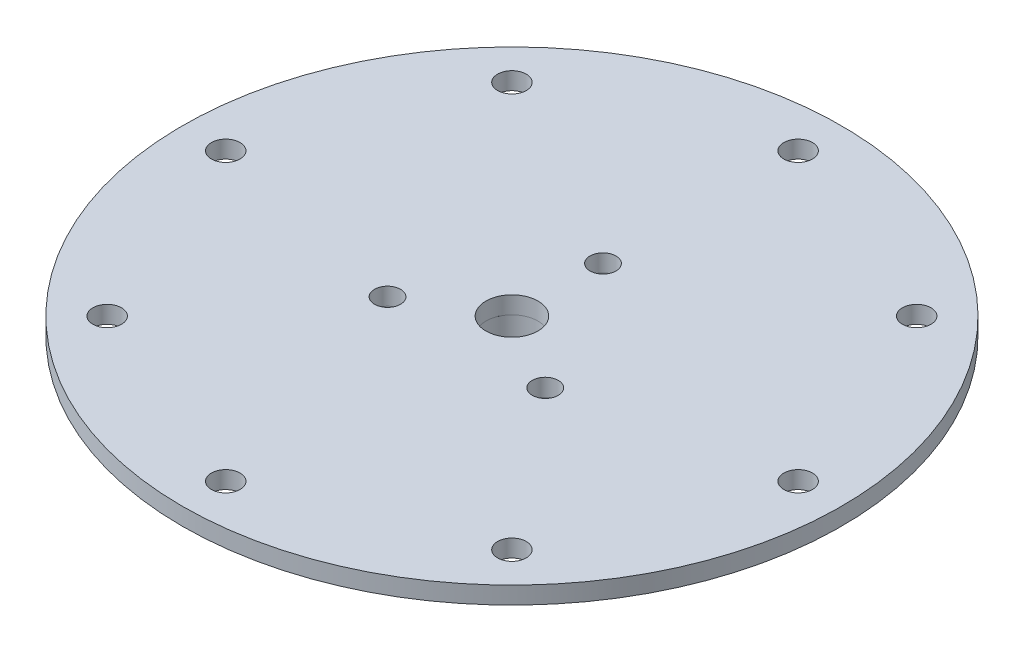
ISO-10303-21;
HEADER;
FILE_DESCRIPTION(('STEP AP214'),'2;1');
FILE_NAME('part.step','',(''),(''),'','','');
FILE_SCHEMA(('AUTOMOTIVE_DESIGN { 1 0 10303 214 1 1 1 1 }'));
ENDSEC;
DATA;
#1=APPLICATION_CONTEXT('core data for automotive mechanical design processes');
#2=APPLICATION_PROTOCOL_DEFINITION('international standard','automotive_design',2000,#1);
#3=PRODUCT_CONTEXT('',#1,'mechanical');
#4=PRODUCT('Part','Part','',(#3));
#5=PRODUCT_RELATED_PRODUCT_CATEGORY('part','',(#4));
#6=PRODUCT_DEFINITION_FORMATION('','',#4);
#7=PRODUCT_DEFINITION_CONTEXT('part definition',#1,'design');
#8=PRODUCT_DEFINITION('design','',#6,#7);
#9=PRODUCT_DEFINITION_SHAPE('','',#8);
#10=(LENGTH_UNIT() NAMED_UNIT(*) SI_UNIT(.MILLI.,.METRE.));
#11=(NAMED_UNIT(*) PLANE_ANGLE_UNIT() SI_UNIT($,.RADIAN.));
#12=(NAMED_UNIT(*) SI_UNIT($,.STERADIAN.) SOLID_ANGLE_UNIT());
#13=UNCERTAINTY_MEASURE_WITH_UNIT(LENGTH_MEASURE(1.E-05),#10,'distance_accuracy_value','');
#14=(GEOMETRIC_REPRESENTATION_CONTEXT(3) GLOBAL_UNCERTAINTY_ASSIGNED_CONTEXT((#13)) GLOBAL_UNIT_ASSIGNED_CONTEXT((#10,
#11,#12)) REPRESENTATION_CONTEXT('',''));
#15=CARTESIAN_POINT('',(0.,0.,0.));
#16=DIRECTION('',(0.,0.,1.));
#17=DIRECTION('',(1.,0.,0.));
#18=AXIS2_PLACEMENT_3D('',#15,#16,#17);
#19=CARTESIAN_POINT('',(0.,-7.23678090575275,0.));
#20=DIRECTION('',(0.,1.,0.));
#21=DIRECTION('',(0.,0.,1.));
#22=AXIS2_PLACEMENT_3D('',#19,#20,#21);
#23=PLANE('',#22);
#24=CARTESIAN_POINT('',(0.,-7.23678090575275,-33.));
#25=DIRECTION('',(0.,1.,0.));
#26=DIRECTION('',(0.,0.,1.));
#27=AXIS2_PLACEMENT_3D('',#24,#25,#26);
#28=CIRCLE('',#27,1.65);
#29=CARTESIAN_POINT('',(0.,-7.23678090575275,-31.35));
#30=VERTEX_POINT('',#29);
#31=EDGE_CURVE('E113',#30,#30,#28,.T.);
#32=ORIENTED_EDGE('',*,*,#31,.F.);
#33=EDGE_LOOP('',(#32));
#34=FACE_BOUND('',#33,.T.);
#35=CARTESIAN_POINT('',(-33.,-7.23678090575275,0.));
#36=DIRECTION('',(0.,1.,0.));
#37=DIRECTION('',(0.,0.,1.));
#38=AXIS2_PLACEMENT_3D('',#35,#36,#37);
#39=CIRCLE('',#38,1.65);
#40=CARTESIAN_POINT('',(-33.,-7.23678090575275,1.65));
#41=VERTEX_POINT('',#40);
#42=EDGE_CURVE('E101',#41,#41,#39,.T.);
#43=ORIENTED_EDGE('',*,*,#42,.F.);
#44=EDGE_LOOP('',(#43));
#45=FACE_BOUND('',#44,.T.);
#46=CARTESIAN_POINT('',(0.,-7.23678090575275,33.));
#47=DIRECTION('',(0.,1.,0.));
#48=DIRECTION('',(0.,0.,1.));
#49=AXIS2_PLACEMENT_3D('',#46,#47,#48);
#50=CIRCLE('',#49,1.65);
#51=CARTESIAN_POINT('',(0.,-7.23678090575275,34.65));
#52=VERTEX_POINT('',#51);
#53=EDGE_CURVE('E89',#52,#52,#50,.T.);
#54=ORIENTED_EDGE('',*,*,#53,.F.);
#55=EDGE_LOOP('',(#54));
#56=FACE_BOUND('',#55,.T.);
#57=CARTESIAN_POINT('',(33.,-7.23678090575275,0.));
#58=DIRECTION('',(0.,1.,0.));
#59=DIRECTION('',(0.,0.,1.));
#60=AXIS2_PLACEMENT_3D('',#57,#58,#59);
#61=CIRCLE('',#60,1.65);
#62=CARTESIAN_POINT('',(33.,-7.23678090575275,1.65));
#63=VERTEX_POINT('',#62);
#64=EDGE_CURVE('E77',#63,#63,#61,.T.);
#65=ORIENTED_EDGE('',*,*,#64,.F.);
#66=EDGE_LOOP('',(#65));
#67=FACE_BOUND('',#66,.T.);
#68=CARTESIAN_POINT('',(-9.09326673973658,-7.23678090575275,5.25000000000004));
#69=DIRECTION('',(0.,1.,0.));
#70=DIRECTION('',(0.,0.,1.));
#71=AXIS2_PLACEMENT_3D('',#68,#69,#70);
#72=CIRCLE('',#71,1.5);
#73=CARTESIAN_POINT('',(-9.09326673973658,-7.23678090575275,6.75000000000005));
#74=VERTEX_POINT('',#73);
#75=EDGE_CURVE('E65',#74,#74,#72,.T.);
#76=ORIENTED_EDGE('',*,*,#75,.F.);
#77=EDGE_LOOP('',(#76));
#78=FACE_BOUND('',#77,.T.);
#79=CARTESIAN_POINT('',(0.,-7.23678090575275,-10.5));
#80=DIRECTION('',(0.,1.,0.));
#81=DIRECTION('',(0.,0.,1.));
#82=AXIS2_PLACEMENT_3D('',#79,#80,#81);
#83=CIRCLE('',#82,1.5);
#84=CARTESIAN_POINT('',(0.,-7.23678090575275,-9.));
#85=VERTEX_POINT('',#84);
#86=EDGE_CURVE('E54',#85,#85,#83,.T.);
#87=ORIENTED_EDGE('',*,*,#86,.F.);
#88=EDGE_LOOP('',(#87));
#89=FACE_BOUND('',#88,.T.);
#90=CARTESIAN_POINT('',(0.,-7.23678090575275,0.));
#91=DIRECTION('',(0.,1.,0.));
#92=DIRECTION('',(0.,0.,1.));
#93=AXIS2_PLACEMENT_3D('',#90,#91,#92);
#94=CIRCLE('',#93,38.);
#95=CARTESIAN_POINT('',(0.,-7.23678090575275,38.));
#96=VERTEX_POINT('',#95);
#97=EDGE_CURVE('E11',#96,#96,#94,.T.);
#98=ORIENTED_EDGE('',*,*,#97,.T.);
#99=EDGE_LOOP('',(#98));
#100=FACE_BOUND('',#99,.T.);
#101=CARTESIAN_POINT('',(9.09326673973662,-7.23678090575275,5.24999999999998));
#102=DIRECTION('',(0.,1.,0.));
#103=DIRECTION('',(0.,0.,1.));
#104=AXIS2_PLACEMENT_3D('',#101,#102,#103);
#105=CIRCLE('',#104,1.5);
#106=CARTESIAN_POINT('',(9.09326673973662,-7.23678090575275,6.74999999999998));
#107=VERTEX_POINT('',#106);
#108=EDGE_CURVE('E59',#107,#107,#105,.T.);
#109=ORIENTED_EDGE('',*,*,#108,.F.);
#110=EDGE_LOOP('',(#109));
#111=FACE_BOUND('',#110,.T.);
#112=CARTESIAN_POINT('',(0.,-7.23678090575275,0.));
#113=DIRECTION('',(0.,1.,0.));
#114=DIRECTION('',(0.,0.,1.));
#115=AXIS2_PLACEMENT_3D('',#112,#113,#114);
#116=CIRCLE('',#115,3.);
#117=CARTESIAN_POINT('',(0.,-7.23678090575275,3.));
#118=VERTEX_POINT('',#117);
#119=EDGE_CURVE('E71',#118,#118,#116,.T.);
#120=ORIENTED_EDGE('',*,*,#119,.F.);
#121=EDGE_LOOP('',(#120));
#122=FACE_BOUND('',#121,.T.);
#123=CARTESIAN_POINT('',(23.3345237791561,-7.23678090575275,23.3345237791561));
#124=DIRECTION('',(0.,1.,0.));
#125=DIRECTION('',(0.,0.,1.));
#126=AXIS2_PLACEMENT_3D('',#123,#124,#125);
#127=CIRCLE('',#126,1.65);
#128=CARTESIAN_POINT('',(23.3345237791561,-7.23678090575275,24.9845237791561));
#129=VERTEX_POINT('',#128);
#130=EDGE_CURVE('E83',#129,#129,#127,.T.);
#131=ORIENTED_EDGE('',*,*,#130,.F.);
#132=EDGE_LOOP('',(#131));
#133=FACE_BOUND('',#132,.T.);
#134=CARTESIAN_POINT('',(-23.3345237791561,-7.23678090575275,23.3345237791561));
#135=DIRECTION('',(0.,1.,0.));
#136=DIRECTION('',(0.,0.,1.));
#137=AXIS2_PLACEMENT_3D('',#134,#135,#136);
#138=CIRCLE('',#137,1.65);
#139=CARTESIAN_POINT('',(-23.3345237791561,-7.23678090575275,24.9845237791561));
#140=VERTEX_POINT('',#139);
#141=EDGE_CURVE('E95',#140,#140,#138,.T.);
#142=ORIENTED_EDGE('',*,*,#141,.F.);
#143=EDGE_LOOP('',(#142));
#144=FACE_BOUND('',#143,.T.);
#145=CARTESIAN_POINT('',(-23.3345237791561,-7.23678090575275,-23.3345237791561));
#146=DIRECTION('',(0.,1.,0.));
#147=DIRECTION('',(0.,0.,1.));
#148=AXIS2_PLACEMENT_3D('',#145,#146,#147);
#149=CIRCLE('',#148,1.65);
#150=CARTESIAN_POINT('',(-23.3345237791561,-7.23678090575275,-21.6845237791561));
#151=VERTEX_POINT('',#150);
#152=EDGE_CURVE('E107',#151,#151,#149,.T.);
#153=ORIENTED_EDGE('',*,*,#152,.F.);
#154=EDGE_LOOP('',(#153));
#155=FACE_BOUND('',#154,.T.);
#156=CARTESIAN_POINT('',(23.3345237791561,-7.23678090575275,-23.3345237791561));
#157=DIRECTION('',(0.,1.,0.));
#158=DIRECTION('',(0.,0.,1.));
#159=AXIS2_PLACEMENT_3D('',#156,#157,#158);
#160=CIRCLE('',#159,1.65);
#161=CARTESIAN_POINT('',(23.3345237791561,-7.23678090575275,-21.6845237791561));
#162=VERTEX_POINT('',#161);
#163=EDGE_CURVE('E119',#162,#162,#160,.T.);
#164=ORIENTED_EDGE('',*,*,#163,.F.);
#165=EDGE_LOOP('',(#164));
#166=FACE_BOUND('',#165,.T.);
#167=ADVANCED_FACE('F43',(#34,#45,#56,#67,#78,#89,#100,#111,#122,#133,#144,#155,#166),#23,.T.);
#168=CARTESIAN_POINT('',(0.,-9.23678090575275,0.));
#169=DIRECTION('',(0.,1.,0.));
#170=DIRECTION('',(0.,0.,1.));
#171=AXIS2_PLACEMENT_3D('',#168,#169,#170);
#172=PLANE('',#171);
#173=CARTESIAN_POINT('',(0.,-9.23678090575275,0.));
#174=DIRECTION('',(0.,1.,0.));
#175=DIRECTION('',(0.,0.,1.));
#176=AXIS2_PLACEMENT_3D('',#173,#174,#175);
#177=CIRCLE('',#176,38.);
#178=CARTESIAN_POINT('',(0.,-9.23678090575275,38.));
#179=VERTEX_POINT('',#178);
#180=EDGE_CURVE('E47',#179,#179,#177,.T.);
#181=ORIENTED_EDGE('',*,*,#180,.F.);
#182=EDGE_LOOP('',(#181));
#183=FACE_BOUND('',#182,.T.);
#184=CARTESIAN_POINT('',(0.,-9.23678090575275,-10.5));
#185=DIRECTION('',(0.,1.,0.));
#186=DIRECTION('',(0.,0.,1.));
#187=AXIS2_PLACEMENT_3D('',#184,#185,#186);
#188=CIRCLE('',#187,1.5);
#189=CARTESIAN_POINT('',(0.,-9.23678090575275,-9.));
#190=VERTEX_POINT('',#189);
#191=EDGE_CURVE('E56',#190,#190,#188,.T.);
#192=ORIENTED_EDGE('',*,*,#191,.T.);
#193=EDGE_LOOP('',(#192));
#194=FACE_BOUND('',#193,.T.);
#195=CARTESIAN_POINT('',(9.09326673973662,-9.23678090575275,5.24999999999998));
#196=DIRECTION('',(0.,1.,0.));
#197=DIRECTION('',(0.,0.,1.));
#198=AXIS2_PLACEMENT_3D('',#195,#196,#197);
#199=CIRCLE('',#198,1.5);
#200=CARTESIAN_POINT('',(9.09326673973662,-9.23678090575275,6.74999999999998));
#201=VERTEX_POINT('',#200);
#202=EDGE_CURVE('E62',#201,#201,#199,.T.);
#203=ORIENTED_EDGE('',*,*,#202,.T.);
#204=EDGE_LOOP('',(#203));
#205=FACE_BOUND('',#204,.T.);
#206=CARTESIAN_POINT('',(-9.09326673973658,-9.23678090575275,5.25000000000004));
#207=DIRECTION('',(0.,1.,0.));
#208=DIRECTION('',(0.,0.,1.));
#209=AXIS2_PLACEMENT_3D('',#206,#207,#208);
#210=CIRCLE('',#209,1.5);
#211=CARTESIAN_POINT('',(-9.09326673973658,-9.23678090575275,6.75000000000005));
#212=VERTEX_POINT('',#211);
#213=EDGE_CURVE('E68',#212,#212,#210,.T.);
#214=ORIENTED_EDGE('',*,*,#213,.T.);
#215=EDGE_LOOP('',(#214));
#216=FACE_BOUND('',#215,.T.);
#217=CARTESIAN_POINT('',(0.,-9.23678090575275,0.));
#218=DIRECTION('',(0.,1.,0.));
#219=DIRECTION('',(0.,0.,1.));
#220=AXIS2_PLACEMENT_3D('',#217,#218,#219);
#221=CIRCLE('',#220,3.);
#222=CARTESIAN_POINT('',(0.,-9.23678090575275,3.));
#223=VERTEX_POINT('',#222);
#224=EDGE_CURVE('E74',#223,#223,#221,.T.);
#225=ORIENTED_EDGE('',*,*,#224,.T.);
#226=EDGE_LOOP('',(#225));
#227=FACE_BOUND('',#226,.T.);
#228=CARTESIAN_POINT('',(33.,-9.23678090575275,0.));
#229=DIRECTION('',(0.,1.,0.));
#230=DIRECTION('',(0.,0.,1.));
#231=AXIS2_PLACEMENT_3D('',#228,#229,#230);
#232=CIRCLE('',#231,1.65);
#233=CARTESIAN_POINT('',(33.,-9.23678090575275,1.65));
#234=VERTEX_POINT('',#233);
#235=EDGE_CURVE('E80',#234,#234,#232,.T.);
#236=ORIENTED_EDGE('',*,*,#235,.T.);
#237=EDGE_LOOP('',(#236));
#238=FACE_BOUND('',#237,.T.);
#239=CARTESIAN_POINT('',(23.3345237791561,-9.23678090575275,23.3345237791561));
#240=DIRECTION('',(0.,1.,0.));
#241=DIRECTION('',(0.,0.,1.));
#242=AXIS2_PLACEMENT_3D('',#239,#240,#241);
#243=CIRCLE('',#242,1.65);
#244=CARTESIAN_POINT('',(23.3345237791561,-9.23678090575275,24.9845237791561));
#245=VERTEX_POINT('',#244);
#246=EDGE_CURVE('E86',#245,#245,#243,.T.);
#247=ORIENTED_EDGE('',*,*,#246,.T.);
#248=EDGE_LOOP('',(#247));
#249=FACE_BOUND('',#248,.T.);
#250=CARTESIAN_POINT('',(0.,-9.23678090575275,33.));
#251=DIRECTION('',(0.,1.,0.));
#252=DIRECTION('',(0.,0.,1.));
#253=AXIS2_PLACEMENT_3D('',#250,#251,#252);
#254=CIRCLE('',#253,1.65);
#255=CARTESIAN_POINT('',(0.,-9.23678090575275,34.65));
#256=VERTEX_POINT('',#255);
#257=EDGE_CURVE('E92',#256,#256,#254,.T.);
#258=ORIENTED_EDGE('',*,*,#257,.T.);
#259=EDGE_LOOP('',(#258));
#260=FACE_BOUND('',#259,.T.);
#261=CARTESIAN_POINT('',(-23.3345237791561,-9.23678090575275,23.3345237791561));
#262=DIRECTION('',(0.,1.,0.));
#263=DIRECTION('',(0.,0.,1.));
#264=AXIS2_PLACEMENT_3D('',#261,#262,#263);
#265=CIRCLE('',#264,1.65);
#266=CARTESIAN_POINT('',(-23.3345237791561,-9.23678090575275,24.9845237791561));
#267=VERTEX_POINT('',#266);
#268=EDGE_CURVE('E98',#267,#267,#265,.T.);
#269=ORIENTED_EDGE('',*,*,#268,.T.);
#270=EDGE_LOOP('',(#269));
#271=FACE_BOUND('',#270,.T.);
#272=CARTESIAN_POINT('',(-33.,-9.23678090575275,0.));
#273=DIRECTION('',(0.,1.,0.));
#274=DIRECTION('',(0.,0.,1.));
#275=AXIS2_PLACEMENT_3D('',#272,#273,#274);
#276=CIRCLE('',#275,1.65);
#277=CARTESIAN_POINT('',(-33.,-9.23678090575275,1.65));
#278=VERTEX_POINT('',#277);
#279=EDGE_CURVE('E104',#278,#278,#276,.T.);
#280=ORIENTED_EDGE('',*,*,#279,.T.);
#281=EDGE_LOOP('',(#280));
#282=FACE_BOUND('',#281,.T.);
#283=CARTESIAN_POINT('',(-23.3345237791561,-9.23678090575275,-23.3345237791561));
#284=DIRECTION('',(0.,1.,0.));
#285=DIRECTION('',(0.,0.,1.));
#286=AXIS2_PLACEMENT_3D('',#283,#284,#285);
#287=CIRCLE('',#286,1.65);
#288=CARTESIAN_POINT('',(-23.3345237791561,-9.23678090575275,-21.6845237791561));
#289=VERTEX_POINT('',#288);
#290=EDGE_CURVE('E110',#289,#289,#287,.T.);
#291=ORIENTED_EDGE('',*,*,#290,.T.);
#292=EDGE_LOOP('',(#291));
#293=FACE_BOUND('',#292,.T.);
#294=CARTESIAN_POINT('',(0.,-9.23678090575275,-33.));
#295=DIRECTION('',(0.,1.,0.));
#296=DIRECTION('',(0.,0.,1.));
#297=AXIS2_PLACEMENT_3D('',#294,#295,#296);
#298=CIRCLE('',#297,1.65);
#299=CARTESIAN_POINT('',(0.,-9.23678090575275,-31.35));
#300=VERTEX_POINT('',#299);
#301=EDGE_CURVE('E116',#300,#300,#298,.T.);
#302=ORIENTED_EDGE('',*,*,#301,.T.);
#303=EDGE_LOOP('',(#302));
#304=FACE_BOUND('',#303,.T.);
#305=CARTESIAN_POINT('',(23.3345237791561,-9.23678090575275,-23.3345237791561));
#306=DIRECTION('',(0.,1.,0.));
#307=DIRECTION('',(0.,0.,1.));
#308=AXIS2_PLACEMENT_3D('',#305,#306,#307);
#309=CIRCLE('',#308,1.65);
#310=CARTESIAN_POINT('',(23.3345237791561,-9.23678090575275,-21.6845237791561));
#311=VERTEX_POINT('',#310);
#312=EDGE_CURVE('E122',#311,#311,#309,.T.);
#313=ORIENTED_EDGE('',*,*,#312,.T.);
#314=EDGE_LOOP('',(#313));
#315=FACE_BOUND('',#314,.T.);
#316=ADVANCED_FACE('F132',(#183,#194,#205,#216,#227,#238,#249,#260,#271,#282,#293,#304,#315),
#172,.F.);
#317=CARTESIAN_POINT('',(0.,-7.23678090575275,0.));
#318=DIRECTION('',(0.,-1.,0.));
#319=DIRECTION('',(0.,0.,-1.));
#320=AXIS2_PLACEMENT_3D('',#317,#318,#319);
#321=CYLINDRICAL_SURFACE('',#320,38.);
#322=ORIENTED_EDGE('',*,*,#97,.F.);
#323=EDGE_LOOP('',(#322));
#324=FACE_BOUND('',#323,.T.);
#325=ORIENTED_EDGE('',*,*,#180,.T.);
#326=EDGE_LOOP('',(#325));
#327=FACE_BOUND('',#326,.T.);
#328=ADVANCED_FACE('F45',(#324,#327),#321,.T.);
#329=CARTESIAN_POINT('',(0.,-7.23678090575275,-10.5));
#330=DIRECTION('',(0.,-1.,0.));
#331=DIRECTION('',(0.,0.,-1.));
#332=AXIS2_PLACEMENT_3D('',#329,#330,#331);
#333=CYLINDRICAL_SURFACE('',#332,1.5);
#334=ORIENTED_EDGE('',*,*,#86,.T.);
#335=EDGE_LOOP('',(#334));
#336=FACE_BOUND('',#335,.T.);
#337=ORIENTED_EDGE('',*,*,#191,.F.);
#338=EDGE_LOOP('',(#337));
#339=FACE_BOUND('',#338,.T.);
#340=ADVANCED_FACE('F142',(#336,#339),#333,.F.);
#341=CARTESIAN_POINT('',(9.09326673973662,-7.23678090575275,5.24999999999998));
#342=DIRECTION('',(0.,-1.,0.));
#343=DIRECTION('',(0.,0.,-1.));
#344=AXIS2_PLACEMENT_3D('',#341,#342,#343);
#345=CYLINDRICAL_SURFACE('',#344,1.5);
#346=ORIENTED_EDGE('',*,*,#108,.T.);
#347=EDGE_LOOP('',(#346));
#348=FACE_BOUND('',#347,.T.);
#349=ORIENTED_EDGE('',*,*,#202,.F.);
#350=EDGE_LOOP('',(#349));
#351=FACE_BOUND('',#350,.T.);
#352=ADVANCED_FACE('F145',(#348,#351),#345,.F.);
#353=CARTESIAN_POINT('',(-9.09326673973658,-7.23678090575275,5.25000000000004));
#354=DIRECTION('',(0.,-1.,0.));
#355=DIRECTION('',(0.,0.,-1.));
#356=AXIS2_PLACEMENT_3D('',#353,#354,#355);
#357=CYLINDRICAL_SURFACE('',#356,1.5);
#358=ORIENTED_EDGE('',*,*,#75,.T.);
#359=EDGE_LOOP('',(#358));
#360=FACE_BOUND('',#359,.T.);
#361=ORIENTED_EDGE('',*,*,#213,.F.);
#362=EDGE_LOOP('',(#361));
#363=FACE_BOUND('',#362,.T.);
#364=ADVANCED_FACE('F149',(#360,#363),#357,.F.);
#365=CARTESIAN_POINT('',(0.,-7.23678090575275,0.));
#366=DIRECTION('',(0.,-1.,0.));
#367=DIRECTION('',(0.,0.,-1.));
#368=AXIS2_PLACEMENT_3D('',#365,#366,#367);
#369=CYLINDRICAL_SURFACE('',#368,3.);
#370=ORIENTED_EDGE('',*,*,#119,.T.);
#371=EDGE_LOOP('',(#370));
#372=FACE_BOUND('',#371,.T.);
#373=ORIENTED_EDGE('',*,*,#224,.F.);
#374=EDGE_LOOP('',(#373));
#375=FACE_BOUND('',#374,.T.);
#376=ADVANCED_FACE('F153',(#372,#375),#369,.F.);
#377=CARTESIAN_POINT('',(33.,-7.23678090575275,0.));
#378=DIRECTION('',(0.,-1.,0.));
#379=DIRECTION('',(0.,0.,-1.));
#380=AXIS2_PLACEMENT_3D('',#377,#378,#379);
#381=CYLINDRICAL_SURFACE('',#380,1.65);
#382=ORIENTED_EDGE('',*,*,#64,.T.);
#383=EDGE_LOOP('',(#382));
#384=FACE_BOUND('',#383,.T.);
#385=ORIENTED_EDGE('',*,*,#235,.F.);
#386=EDGE_LOOP('',(#385));
#387=FACE_BOUND('',#386,.T.);
#388=ADVANCED_FACE('F157',(#384,#387),#381,.F.);
#389=CARTESIAN_POINT('',(23.3345237791561,-7.23678090575275,23.3345237791561));
#390=DIRECTION('',(0.,-1.,0.));
#391=DIRECTION('',(0.,0.,-1.));
#392=AXIS2_PLACEMENT_3D('',#389,#390,#391);
#393=CYLINDRICAL_SURFACE('',#392,1.65);
#394=ORIENTED_EDGE('',*,*,#130,.T.);
#395=EDGE_LOOP('',(#394));
#396=FACE_BOUND('',#395,.T.);
#397=ORIENTED_EDGE('',*,*,#246,.F.);
#398=EDGE_LOOP('',(#397));
#399=FACE_BOUND('',#398,.T.);
#400=ADVANCED_FACE('F161',(#396,#399),#393,.F.);
#401=CARTESIAN_POINT('',(0.,-7.23678090575275,33.));
#402=DIRECTION('',(0.,-1.,0.));
#403=DIRECTION('',(0.,0.,-1.));
#404=AXIS2_PLACEMENT_3D('',#401,#402,#403);
#405=CYLINDRICAL_SURFACE('',#404,1.65);
#406=ORIENTED_EDGE('',*,*,#53,.T.);
#407=EDGE_LOOP('',(#406));
#408=FACE_BOUND('',#407,.T.);
#409=ORIENTED_EDGE('',*,*,#257,.F.);
#410=EDGE_LOOP('',(#409));
#411=FACE_BOUND('',#410,.T.);
#412=ADVANCED_FACE('F165',(#408,#411),#405,.F.);
#413=CARTESIAN_POINT('',(-23.3345237791561,-7.23678090575275,23.3345237791561));
#414=DIRECTION('',(0.,-1.,0.));
#415=DIRECTION('',(0.,0.,-1.));
#416=AXIS2_PLACEMENT_3D('',#413,#414,#415);
#417=CYLINDRICAL_SURFACE('',#416,1.65);
#418=ORIENTED_EDGE('',*,*,#141,.T.);
#419=EDGE_LOOP('',(#418));
#420=FACE_BOUND('',#419,.T.);
#421=ORIENTED_EDGE('',*,*,#268,.F.);
#422=EDGE_LOOP('',(#421));
#423=FACE_BOUND('',#422,.T.);
#424=ADVANCED_FACE('F169',(#420,#423),#417,.F.);
#425=CARTESIAN_POINT('',(-33.,-7.23678090575275,0.));
#426=DIRECTION('',(0.,-1.,0.));
#427=DIRECTION('',(0.,0.,-1.));
#428=AXIS2_PLACEMENT_3D('',#425,#426,#427);
#429=CYLINDRICAL_SURFACE('',#428,1.65);
#430=ORIENTED_EDGE('',*,*,#42,.T.);
#431=EDGE_LOOP('',(#430));
#432=FACE_BOUND('',#431,.T.);
#433=ORIENTED_EDGE('',*,*,#279,.F.);
#434=EDGE_LOOP('',(#433));
#435=FACE_BOUND('',#434,.T.);
#436=ADVANCED_FACE('F173',(#432,#435),#429,.F.);
#437=CARTESIAN_POINT('',(-23.3345237791561,-7.23678090575275,-23.3345237791561));
#438=DIRECTION('',(0.,-1.,0.));
#439=DIRECTION('',(0.,0.,-1.));
#440=AXIS2_PLACEMENT_3D('',#437,#438,#439);
#441=CYLINDRICAL_SURFACE('',#440,1.65);
#442=ORIENTED_EDGE('',*,*,#152,.T.);
#443=EDGE_LOOP('',(#442));
#444=FACE_BOUND('',#443,.T.);
#445=ORIENTED_EDGE('',*,*,#290,.F.);
#446=EDGE_LOOP('',(#445));
#447=FACE_BOUND('',#446,.T.);
#448=ADVANCED_FACE('F177',(#444,#447),#441,.F.);
#449=CARTESIAN_POINT('',(0.,-7.23678090575275,-33.));
#450=DIRECTION('',(0.,-1.,0.));
#451=DIRECTION('',(0.,0.,-1.));
#452=AXIS2_PLACEMENT_3D('',#449,#450,#451);
#453=CYLINDRICAL_SURFACE('',#452,1.65);
#454=ORIENTED_EDGE('',*,*,#31,.T.);
#455=EDGE_LOOP('',(#454));
#456=FACE_BOUND('',#455,.T.);
#457=ORIENTED_EDGE('',*,*,#301,.F.);
#458=EDGE_LOOP('',(#457));
#459=FACE_BOUND('',#458,.T.);
#460=ADVANCED_FACE('F181',(#456,#459),#453,.F.);
#461=CARTESIAN_POINT('',(23.3345237791561,-7.23678090575275,-23.3345237791561));
#462=DIRECTION('',(0.,-1.,0.));
#463=DIRECTION('',(0.,0.,-1.));
#464=AXIS2_PLACEMENT_3D('',#461,#462,#463);
#465=CYLINDRICAL_SURFACE('',#464,1.65);
#466=ORIENTED_EDGE('',*,*,#163,.T.);
#467=EDGE_LOOP('',(#466));
#468=FACE_BOUND('',#467,.T.);
#469=ORIENTED_EDGE('',*,*,#312,.F.);
#470=EDGE_LOOP('',(#469));
#471=FACE_BOUND('',#470,.T.);
#472=ADVANCED_FACE('F128',(#468,#471),#465,.F.);
#473=CLOSED_SHELL('',(#167,#316,#328,#340,#352,#364,#376,#388,#400,#412,#424,#436,#448,#460,#472));
#474=MANIFOLD_SOLID_BREP('B2',#473);
#475=CARTESIAN_POINT('',(0.,-25.2367809057528,0.));
#476=DIRECTION('',(0.,-1.,0.));
#477=DIRECTION('',(0.,0.,-1.));
#478=AXIS2_PLACEMENT_3D('',#475,#476,#477);
#479=CYLINDRICAL_SURFACE('',#478,3.);
#480=CARTESIAN_POINT('',(0.,-9.23678090575275,0.));
#481=DIRECTION('',(0.,-1.,0.));
#482=DIRECTION('',(0.,0.,-1.));
#483=AXIS2_PLACEMENT_3D('',#480,#481,#482);
#484=CIRCLE('',#483,3.);
#485=CARTESIAN_POINT('',(0.,-9.23678090575275,-3.));
#486=VERTEX_POINT('',#485);
#487=EDGE_CURVE('E348',#486,#486,#484,.T.);
#488=ORIENTED_EDGE('',*,*,#487,.F.);
#489=EDGE_LOOP('',(#488));
#490=FACE_BOUND('',#489,.T.);
#491=CARTESIAN_POINT('',(0.,-25.2367809057528,0.));
#492=DIRECTION('',(0.,-1.,0.));
#493=DIRECTION('',(0.,0.,-1.));
#494=AXIS2_PLACEMENT_3D('',#491,#492,#493);
#495=CIRCLE('',#494,3.);
#496=CARTESIAN_POINT('',(0.,-25.2367809057528,-3.));
#497=VERTEX_POINT('',#496);
#498=EDGE_CURVE('E42',#497,#497,#495,.T.);
#499=ORIENTED_EDGE('',*,*,#498,.T.);
#500=EDGE_LOOP('',(#499));
#501=FACE_BOUND('',#500,.T.);
#502=CARTESIAN_POINT('',(-2.,-17.2367809057528,2.23606797749979));
#503=CARTESIAN_POINT('',(-1.99999453997731,-17.1391525948841,2.23607753462817));
#504=CARTESIAN_POINT('',(-1.99278992503664,-17.0414901520439,2.24258071047442));
#505=CARTESIAN_POINT('',(-1.96458268317731,-16.8496609941019,2.26731972501617));
#506=CARTESIAN_POINT('',(-1.94355530587862,-16.7555008702232,2.2855766081271));
#507=CARTESIAN_POINT('',(-1.88935861676632,-16.5740454638751,2.3305658582557));
#508=CARTESIAN_POINT('',(-1.85630718014214,-16.4866932090151,2.35721561794602));
#509=CARTESIAN_POINT('',(-1.77934008393538,-16.3189150734061,2.41584094681825));
#510=CARTESIAN_POINT('',(-1.73542216812163,-16.2384906357763,2.44781762158831));
#511=CARTESIAN_POINT('',(-1.63002410007714,-16.0731340181358,2.51946072932026));
#512=CARTESIAN_POINT('',(-1.56687435451732,-15.9894487880356,2.55954936090364));
#513=CARTESIAN_POINT('',(-1.4281921974068,-15.8327781968785,2.63944827308083));
#514=CARTESIAN_POINT('',(-1.3526477317708,-15.7598033840942,2.67925824297985));
#515=CARTESIAN_POINT('',(-1.17815690494295,-15.6161372469711,2.76088818523747));
#516=CARTESIAN_POINT('',(-1.07740643965819,-15.5472983939771,2.80216785846923));
#517=CARTESIAN_POINT('',(-0.862470964212233,-15.4281388102627,2.87558484482764));
#518=CARTESIAN_POINT('',(-0.748301152321704,-15.3777973917216,2.90773236231037));
#519=CARTESIAN_POINT('',(-0.523249073480004,-15.3032245047353,2.95599907464725));
#520=CARTESIAN_POINT('',(-0.413434725181417,-15.2766975612572,2.97351175615867));
#521=CARTESIAN_POINT('',(-0.189695448729863,-15.2425964164691,2.99609745461921));
#522=CARTESIAN_POINT('',(-0.0757758812858258,-15.2349983465273,3.00118613762359));
#523=CARTESIAN_POINT('',(0.134147050232329,-15.2389533557018,2.99855361722953));
#524=CARTESIAN_POINT('',(0.230240638008752,-15.2477699570698,2.99266264910127));
#525=CARTESIAN_POINT('',(0.419238633271014,-15.2788719571117,2.9720818279002));
#526=CARTESIAN_POINT('',(0.512142807649723,-15.3011583380563,2.95739133313102));
#527=CARTESIAN_POINT('',(0.692077937671168,-15.3579765905473,2.92052091703736));
#528=CARTESIAN_POINT('',(0.779130623845961,-15.3924597909513,2.89837077982679));
#529=CARTESIAN_POINT('',(0.946209150653556,-15.4723345487056,2.84821104476287));
#530=CARTESIAN_POINT('',(1.0262337049694,-15.5177280972543,2.82020037745161));
#531=CARTESIAN_POINT('',(1.18828429196344,-15.6247596432126,2.75618058450702));
#532=CARTESIAN_POINT('',(1.26919148099708,-15.6877484291055,2.71960408792025));
#533=CARTESIAN_POINT('',(1.41998807498305,-15.8246795852331,2.64400601826998));
#534=CARTESIAN_POINT('',(1.48986013519457,-15.8986388516866,2.60498072815232));
#535=CARTESIAN_POINT('',(1.62772235326165,-16.068744115966,2.52150044944152));
#536=CARTESIAN_POINT('',(1.69373593126354,-16.1665519854672,2.47714320008932));
#537=CARTESIAN_POINT('',(1.80834874945482,-16.3742907449735,2.39475610831095));
#538=CARTESIAN_POINT('',(1.85697718654898,-16.4842009001666,2.3567157153489));
#539=CARTESIAN_POINT('',(1.92332724567776,-16.6814999678259,2.30262870306889));
#540=CARTESIAN_POINT('',(1.94590791747533,-16.7663742758096,2.28340364577668));
#541=CARTESIAN_POINT('',(1.97979555580014,-16.9398203955696,2.25409039789612));
#542=CARTESIAN_POINT('',(1.99112206964395,-17.0283855169254,2.24398636782354));
#543=CARTESIAN_POINT('',(2.00179400148877,-17.2072238921942,2.23447556987372));
#544=CARTESIAN_POINT('',(2.00108729753098,-17.2975028842729,2.2351153386647));
#545=CARTESIAN_POINT('',(1.98761629716365,-17.4764647397078,2.24709880368953));
#546=CARTESIAN_POINT('',(1.97484222690381,-17.5651462498601,2.25845117648851));
#547=CARTESIAN_POINT('',(1.93899811187046,-17.7341703233026,2.28927977500746));
#548=CARTESIAN_POINT('',(1.91646174529973,-17.8147086147553,2.30833187069749));
#549=CARTESIAN_POINT('',(1.86223041628513,-17.970907141803,2.3522995853365));
#550=CARTESIAN_POINT('',(1.83053237805351,-18.0465657287158,2.3772171729463));
#551=CARTESIAN_POINT('',(1.75163346599563,-18.2069829096003,2.43611483596194));
#552=CARTESIAN_POINT('',(1.70260028818246,-18.2905377172954,2.47091081434316));
#553=CARTESIAN_POINT('',(1.59352731501438,-18.44919770837,2.54262514806633));
#554=CARTESIAN_POINT('',(1.53347411883827,-18.5242924224952,2.57954604947543));
#555=CARTESIAN_POINT('',(1.38876657712435,-18.6807432532203,2.66075678321007));
#556=CARTESIAN_POINT('',(1.30160386514207,-18.7598837540011,2.70489452138573));
#557=CARTESIAN_POINT('',(1.11309948866219,-18.902597588693,2.78775581841638));
#558=CARTESIAN_POINT('',(1.011770477457,-18.9661846770095,2.82648414789457));
#559=CARTESIAN_POINT('',(0.817487474821797,-19.0646726446703,2.88790821242222));
#560=CARTESIAN_POINT('',(0.72666236488632,-19.1027374101931,2.91225458111008));
#561=CARTESIAN_POINT('',(0.538757079020515,-19.1653881000732,2.95278707867041));
#562=CARTESIAN_POINT('',(0.441682263858769,-19.1899854086125,2.96898009871993));
#563=CARTESIAN_POINT('',(0.243369392303443,-19.2244778695915,2.99178364026746));
#564=CARTESIAN_POINT('',(0.142114836924318,-19.2343075852594,2.99835150856533));
#565=CARTESIAN_POINT('',(-0.0608555465807322,-19.2384287571699,3.00109821029056));
#566=CARTESIAN_POINT('',(-0.162571330953448,-19.2327216577089,2.99727800938901));
#567=CARTESIAN_POINT('',(-0.355757532528105,-19.207121416748,2.98029555977323));
#568=CARTESIAN_POINT('',(-0.447435143070529,-19.1882899208909,2.96783277209856));
#569=CARTESIAN_POINT('',(-0.626018422997061,-19.1385428963219,2.93536106206933));
#570=CARTESIAN_POINT('',(-0.71292334868689,-19.1076254904055,2.91535096747103));
#571=CARTESIAN_POINT('',(-0.88514729660835,-19.0328422008687,2.86791765486194));
#572=CARTESIAN_POINT('',(-0.970083589200263,-18.9883305982577,2.84013248946338));
#573=CARTESIAN_POINT('',(-1.13155266268318,-18.8886302611268,2.77975408235472));
#574=CARTESIAN_POINT('',(-1.20808037205002,-18.8334351378008,2.74715796645263));
#575=CARTESIAN_POINT('',(-1.36329422201402,-18.7041520034164,2.67392931472394));
#576=CARTESIAN_POINT('',(-1.44042679526091,-18.6284578820787,2.6328391387737));
#577=CARTESIAN_POINT('',(-1.58160022281596,-18.4656673642069,2.55053357649486));
#578=CARTESIAN_POINT('',(-1.64563128323923,-18.3785625169187,2.50931811970155));
#579=CARTESIAN_POINT('',(-1.75513253518411,-18.2009133149975,2.43384213590298));
#580=CARTESIAN_POINT('',(-1.8016464689721,-18.1111390958024,2.39929086741904));
#581=CARTESIAN_POINT('',(-1.88115802340272,-17.9234964567596,2.33747501591022));
#582=CARTESIAN_POINT('',(-1.91418190281333,-17.8256442118906,2.31019631295305));
#583=CARTESIAN_POINT('',(-1.95936262470908,-17.6460094373282,2.27191051929539));
#584=CARTESIAN_POINT('',(-1.97452228373248,-17.5654726689625,2.25863695410151));
#585=CARTESIAN_POINT('',(-1.99483915818926,-17.4022245052482,2.24071519216009));
#586=CARTESIAN_POINT('',(-2.00000462703715,-17.3195149614922,2.23605987841475));
#587=CARTESIAN_POINT('',(-2.,-17.2367809057528,2.23606797749979));
#588=B_SPLINE_CURVE_WITH_KNOTS('',3,(#502,#503,#504,#505,#506,#507,#508,#509,#510,#511,#512,
#513,#514,#515,#516,#517,#518,#519,#520,#521,#522,#523,#524,#525,#526,#527,#528,#529,#530,#531,
#532,#533,#534,#535,#536,#537,#538,#539,#540,#541,#542,#543,#544,#545,#546,#547,#548,#549,#550,
#551,#552,#553,#554,#555,#556,#557,#558,#559,#560,#561,#562,#563,#564,#565,#566,#567,#568,#569,
#570,#571,#572,#573,#574,#575,#576,#577,#578,#579,#580,#581,#582,#583,#584,#585,#586,#587),
.UNSPECIFIED.,.T.,.F.,(4,2,2,2,2,2,2,2,2,2,2,2,2,2,2,2,2,2,2,2,2,2,2,2,2,2,2,2,2,2,2,2,2,2,2,2,
2,2,2,2,2,2,4),(0.,0.292506930722154,0.585539042259288,0.875772651216276,1.16606657266549,
1.50154677068638,1.83735518436275,2.22167031006289,2.6055542938858,2.94637482063579,
3.28676536688298,3.57539534955742,3.86404638283746,4.15155831973191,4.43912276903,
4.76447525946635,5.09033414796638,5.46678703504944,5.84260469743948,6.11126090401324,
6.37944966235486,6.64880037638036,6.91836943570598,7.17476451706936,7.43124577644957,
7.73899230052351,8.04711556801509,8.42254684520963,8.7976449057258,9.10070580611698,
9.40351012888472,9.70765229266164,10.0117661844615,10.2937678224973,10.5758132789284,
10.874178629859,11.1727229593109,11.5182220628451,11.863978504186,12.1833412579672,
12.5020793664923,12.7501661630426,12.9980479966543),.UNSPECIFIED.);
#589=CARTESIAN_POINT('',(-2.,-17.2367809057528,2.23606797749979));
#590=VERTEX_POINT('',#589);
#591=EDGE_CURVE('E401',#590,#590,#588,.T.);
#592=ORIENTED_EDGE('',*,*,#591,.F.);
#593=EDGE_LOOP('',(#592));
#594=FACE_BOUND('',#593,.T.);
#595=ADVANCED_FACE('F336',(#490,#501,#594),#479,.F.);
#596=CARTESIAN_POINT('',(0.,-25.2367809057528,0.));
#597=DIRECTION('',(0.,-1.,0.));
#598=DIRECTION('',(0.,0.,-1.));
#599=AXIS2_PLACEMENT_3D('',#596,#597,#598);
#600=CYLINDRICAL_SURFACE('',#599,7.5);
#601=CARTESIAN_POINT('',(0.,-25.2367809057528,0.));
#602=DIRECTION('',(0.,-1.,0.));
#603=DIRECTION('',(0.,0.,-1.));
#604=AXIS2_PLACEMENT_3D('',#601,#602,#603);
#605=CIRCLE('',#604,7.5);
#606=CARTESIAN_POINT('',(0.,-25.2367809057528,-7.5));
#607=VERTEX_POINT('',#606);
#608=EDGE_CURVE('E360',#607,#607,#605,.T.);
#609=ORIENTED_EDGE('',*,*,#608,.F.);
#610=EDGE_LOOP('',(#609));
#611=FACE_BOUND('',#610,.T.);
#612=CARTESIAN_POINT('',(0.,-13.2367809057528,0.));
#613=DIRECTION('',(0.,-1.,0.));
#614=DIRECTION('',(0.,0.,-1.));
#615=AXIS2_PLACEMENT_3D('',#612,#613,#614);
#616=CIRCLE('',#615,7.5);
#617=CARTESIAN_POINT('',(0.,-13.2367809057528,-7.5));
#618=VERTEX_POINT('',#617);
#619=EDGE_CURVE('E379',#618,#618,#616,.T.);
#620=ORIENTED_EDGE('',*,*,#619,.T.);
#621=EDGE_LOOP('',(#620));
#622=FACE_BOUND('',#621,.T.);
#623=CARTESIAN_POINT('',(-2.,-17.2367809057528,7.22841614740048));
#624=CARTESIAN_POINT('',(-1.99999734315871,-17.346956843493,7.22841805697252));
#625=CARTESIAN_POINT('',(-1.99086493224743,-17.4571609062288,7.23096264549673));
#626=CARTESIAN_POINT('',(-1.95464583260237,-17.6743863273091,7.24083561155097));
#627=CARTESIAN_POINT('',(-1.92755013620953,-17.7814060607308,7.24816638907934));
#628=CARTESIAN_POINT('',(-1.85635845560073,-17.9890889756995,7.26672375176839));
#629=CARTESIAN_POINT('',(-1.81228637542178,-18.0897608645812,7.27794485684204));
#630=CARTESIAN_POINT('',(-1.70846784563704,-18.2822976458126,7.30301154920401));
#631=CARTESIAN_POINT('',(-1.6487201784145,-18.3741618532597,7.31685734034424));
#632=CARTESIAN_POINT('',(-1.51364847874559,-18.5487734527405,7.34600139553467));
#633=CARTESIAN_POINT('',(-1.43800297504208,-18.6312679232172,7.36132541116443));
#634=CARTESIAN_POINT('',(-1.27397427284021,-18.7825624827039,7.39147701436507));
#635=CARTESIAN_POINT('',(-1.18558975534664,-18.8513611518945,7.40630455033439));
#636=CARTESIAN_POINT('',(-0.996838170873269,-18.9743658441557,7.43407988468418));
#637=CARTESIAN_POINT('',(-0.896301819879479,-19.0283204243856,7.44699376262293));
#638=CARTESIAN_POINT('',(-0.687183044729091,-19.11846554112,7.46919126211834));
#639=CARTESIAN_POINT('',(-0.578601980875103,-19.1546590730343,7.47847549576262));
#640=CARTESIAN_POINT('',(-0.35911596181009,-19.2074361259885,7.49218553576461));
#641=CARTESIAN_POINT('',(-0.248321224200916,-19.2244498823787,7.49671776750265));
#642=CARTESIAN_POINT('',(-0.0253635535085756,-19.2397380258599,7.50078524617749));
#643=CARTESIAN_POINT('',(0.0867991474385298,-19.2380155493829,7.50032132946608));
#644=CARTESIAN_POINT('',(0.306314237111346,-19.2161830932133,7.49452675859765));
#645=CARTESIAN_POINT('',(0.41371660072111,-19.1965379481165,7.48931914026999));
#646=CARTESIAN_POINT('',(0.623641315571055,-19.1401687679708,7.4747674859047));
#647=CARTESIAN_POINT('',(0.72616338818058,-19.1034437590667,7.46542321400589));
#648=CARTESIAN_POINT('',(0.924603945147554,-19.0136010581604,7.44346569099892));
#649=CARTESIAN_POINT('',(1.02044668632954,-18.960324098652,7.43082087877672));
#650=CARTESIAN_POINT('',(1.20198999876452,-18.8390120862437,7.40362468509504));
#651=CARTESIAN_POINT('',(1.28768858808586,-18.7709741567246,7.38907293223));
#652=CARTESIAN_POINT('',(1.44928536946561,-18.6196040478188,7.35911272938719));
#653=CARTESIAN_POINT('',(1.52480192017774,-18.5358664607034,7.34369169368738));
#654=CARTESIAN_POINT('',(1.6608133210477,-18.3567562295139,7.31413405023521));
#655=CARTESIAN_POINT('',(1.72130725529808,-18.2613828765523,7.29999752083065));
#656=CARTESIAN_POINT('',(1.82584679186274,-18.0608808039314,7.27455902280777));
#657=CARTESIAN_POINT('',(1.86978866600526,-17.9556955548396,7.26327507092156));
#658=CARTESIAN_POINT('',(1.93924001685674,-17.7390544062978,7.24504325087515));
#659=CARTESIAN_POINT('',(1.96475406461341,-17.6276000693024,7.23809430746845));
#660=CARTESIAN_POINT('',(1.99596757092855,-17.4051536947244,7.22954835612976));
#661=CARTESIAN_POINT('',(2.00223632621177,-17.2942473571314,7.22779763213456));
#662=CARTESIAN_POINT('',(1.9963498112297,-17.0729711329442,7.22942578390815));
#663=CARTESIAN_POINT('',(1.98419650172323,-16.9626011905128,7.23280411376438));
#664=CARTESIAN_POINT('',(1.94231271869971,-16.7477243116612,7.24416124318865));
#665=CARTESIAN_POINT('',(1.91292447912922,-16.6431454678155,7.25205039699299));
#666=CARTESIAN_POINT('',(1.83778986725474,-16.4404012743928,7.27145268952784));
#667=CARTESIAN_POINT('',(1.79204135876651,-16.3422367643253,7.28296630148563));
#668=CARTESIAN_POINT('',(1.68432905508707,-16.1527259483175,7.30863572472984));
#669=CARTESIAN_POINT('',(1.62203095237924,-16.061576929863,7.32284404872864));
#670=CARTESIAN_POINT('',(1.48340227987515,-15.8908176040496,7.35217841933666));
#671=CARTESIAN_POINT('',(1.40706907222966,-15.8112094707986,7.36730463810238));
#672=CARTESIAN_POINT('',(1.23990378250484,-15.6634284325028,7.39729964884456));
#673=CARTESIAN_POINT('',(1.14871641600885,-15.5956525287742,7.41214836523848));
#674=CARTESIAN_POINT('',(0.955928435940744,-15.4763699183422,7.43946670017127));
#675=CARTESIAN_POINT('',(0.854328377018885,-15.4248623456738,7.45193644532905));
#676=CARTESIAN_POINT('',(0.644314134825873,-15.3400512733912,7.47301150899261));
#677=CARTESIAN_POINT('',(0.535957852882338,-15.3066118863093,7.48164558480385));
#678=CARTESIAN_POINT('',(0.314899384731321,-15.2584921776884,7.49420303787247));
#679=CARTESIAN_POINT('',(0.202198167320244,-15.2438076989781,7.4981274590498));
#680=CARTESIAN_POINT('',(-0.0206420013461493,-15.2338750820113,7.50077413437691));
#681=CARTESIAN_POINT('',(-0.130753511527864,-15.2380445866216,7.49965226288082));
#682=CARTESIAN_POINT('',(-0.348648304630718,-15.264349399328,7.4926849097886));
#683=CARTESIAN_POINT('',(-0.456431674812814,-15.2864840328698,7.48683960554786));
#684=CARTESIAN_POINT('',(-0.66591012346421,-15.3477615106714,7.47111310390923));
#685=CARTESIAN_POINT('',(-0.76764201185154,-15.3867861992252,7.46125997189229));
#686=CARTESIAN_POINT('',(-0.963172098471354,-15.480630507499,7.43854816516494));
#687=CARTESIAN_POINT('',(-1.05696918166215,-15.5354523423656,7.42568906899253));
#688=CARTESIAN_POINT('',(-1.23667826867367,-15.6610391778898,7.39791331224121));
#689=CARTESIAN_POINT('',(-1.32231336173331,-15.7321902864514,7.38295093371635));
#690=CARTESIAN_POINT('',(-1.48062537156133,-15.8876836551177,7.35284000077256));
#691=CARTESIAN_POINT('',(-1.55329887243048,-15.9720293815721,7.33769139839721));
#692=CARTESIAN_POINT('',(-1.68520700232562,-16.1537493015704,7.30853959638856));
#693=CARTESIAN_POINT('',(-1.74411094261233,-16.25136921941,7.29456891224646));
#694=CARTESIAN_POINT('',(-1.84458689030054,-16.455487216613,7.26981393903472));
#695=CARTESIAN_POINT('',(-1.88617023367332,-16.5619794342922,7.25902756724947));
#696=CARTESIAN_POINT('',(-1.94538124252481,-16.762862241804,7.24336000653874));
#697=CARTESIAN_POINT('',(-1.96581518399489,-16.8563821703095,7.23780140272195));
#698=CARTESIAN_POINT('',(-1.9931249429388,-17.0455214637467,7.2303288521157));
#699=CARTESIAN_POINT('',(-2.0000023063216,-17.1411405880416,7.22841448976016));
#700=CARTESIAN_POINT('',(-2.,-17.2367809057528,7.22841614740048));
#701=B_SPLINE_CURVE_WITH_KNOTS('',3,(#623,#624,#625,#626,#627,#628,#629,#630,#631,#632,#633,
#634,#635,#636,#637,#638,#639,#640,#641,#642,#643,#644,#645,#646,#647,#648,#649,#650,#651,#652,
#653,#654,#655,#656,#657,#658,#659,#660,#661,#662,#663,#664,#665,#666,#667,#668,#669,#670,#671,
#672,#673,#674,#675,#676,#677,#678,#679,#680,#681,#682,#683,#684,#685,#686,#687,#688,#689,#690,
#691,#692,#693,#694,#695,#696,#697,#698,#699,#700),.UNSPECIFIED.,.T.,.F.,(4,2,2,2,2,2,2,2,2,2,2,
2,2,2,2,2,2,2,2,2,2,2,2,2,2,2,2,2,2,2,2,2,2,2,2,2,2,2,4),(0.,0.330176128116026,
0.660517947850201,0.990396311596164,1.32030030656104,1.65765916130211,1.99505297124461,
2.33785207370803,2.68059334304246,3.0154830431648,3.35031668385603,3.67670570800803,
4.00311334440695,4.3327644890557,4.66247993394491,5.0023176230033,5.34217602639579,
5.68413015096536,6.02599942418508,6.35765334242023,6.68927196343503,7.01451850432574,
7.33980752864823,7.67224634967772,8.00474771541474,8.34685906959632,8.68895221008103,
9.028435395914,9.36784331959005,9.69684054916462,10.0258254261296,10.3525451486866,
10.6793107076596,11.0147885399158,11.3503546538105,11.6933003898558,12.0360213210131,
12.3226696767153,12.6092853429065),.UNSPECIFIED.);
#702=CARTESIAN_POINT('',(-2.,-17.2367809057528,7.22841614740048));
#703=VERTEX_POINT('',#702);
#704=EDGE_CURVE('E340',#703,#703,#701,.T.);
#705=ORIENTED_EDGE('',*,*,#704,.F.);
#706=EDGE_LOOP('',(#705));
#707=FACE_BOUND('',#706,.T.);
#708=ADVANCED_FACE('F397',(#611,#622,#707),#600,.T.);
#709=CARTESIAN_POINT('',(-7.5,-25.2367809057528,0.));
#710=DIRECTION('',(0.,1.,0.));
#711=DIRECTION('',(0.,0.,1.));
#712=AXIS2_PLACEMENT_3D('',#709,#710,#711);
#713=PLANE('',#712);
#714=ORIENTED_EDGE('',*,*,#498,.F.);
#715=EDGE_LOOP('',(#714));
#716=FACE_BOUND('',#715,.T.);
#717=ORIENTED_EDGE('',*,*,#608,.T.);
#718=EDGE_LOOP('',(#717));
#719=FACE_BOUND('',#718,.T.);
#720=ADVANCED_FACE('F338',(#716,#719),#713,.F.);
#721=CARTESIAN_POINT('',(-3.,-9.23678090575275,0.));
#722=DIRECTION('',(0.,-1.,0.));
#723=DIRECTION('',(0.,0.,-1.));
#724=AXIS2_PLACEMENT_3D('',#721,#722,#723);
#725=PLANE('',#724);
#726=CARTESIAN_POINT('',(-9.09326673973658,-9.23678090575275,5.25000000000004));
#727=DIRECTION('',(0.,1.,0.));
#728=DIRECTION('',(0.,0.,1.));
#729=AXIS2_PLACEMENT_3D('',#726,#727,#728);
#730=CIRCLE('',#729,1.5);
#731=CARTESIAN_POINT('',(-9.09326673973658,-9.23678090575275,6.75000000000004));
#732=VERTEX_POINT('',#731);
#733=EDGE_CURVE('E365',#732,#732,#730,.T.);
#734=ORIENTED_EDGE('',*,*,#733,.F.);
#735=EDGE_LOOP('',(#734));
#736=FACE_BOUND('',#735,.T.);
#737=CARTESIAN_POINT('',(0.,-9.23678090575275,-10.5));
#738=DIRECTION('',(0.,1.,0.));
#739=DIRECTION('',(0.,0.,1.));
#740=AXIS2_PLACEMENT_3D('',#737,#738,#739);
#741=CIRCLE('',#740,1.5);
#742=CARTESIAN_POINT('',(0.,-9.23678090575275,-9.));
#743=VERTEX_POINT('',#742);
#744=EDGE_CURVE('E375',#743,#743,#741,.T.);
#745=ORIENTED_EDGE('',*,*,#744,.F.);
#746=EDGE_LOOP('',(#745));
#747=FACE_BOUND('',#746,.T.);
#748=CARTESIAN_POINT('',(9.09326673973662,-9.23678090575275,5.24999999999998));
#749=DIRECTION('',(0.,1.,0.));
#750=DIRECTION('',(0.,0.,1.));
#751=AXIS2_PLACEMENT_3D('',#748,#749,#750);
#752=CIRCLE('',#751,1.5);
#753=CARTESIAN_POINT('',(9.09326673973662,-9.23678090575275,6.74999999999998));
#754=VERTEX_POINT('',#753);
#755=EDGE_CURVE('E361',#754,#754,#752,.T.);
#756=ORIENTED_EDGE('',*,*,#755,.F.);
#757=EDGE_LOOP('',(#756));
#758=FACE_BOUND('',#757,.T.);
#759=CARTESIAN_POINT('',(0.,-9.23678090575275,0.));
#760=DIRECTION('',(0.,-1.,0.));
#761=DIRECTION('',(0.,0.,-1.));
#762=AXIS2_PLACEMENT_3D('',#759,#760,#761);
#763=CIRCLE('',#762,14.);
#764=CARTESIAN_POINT('',(0.,-9.23678090575275,-14.));
#765=VERTEX_POINT('',#764);
#766=EDGE_CURVE('E353',#765,#765,#763,.T.);
#767=ORIENTED_EDGE('',*,*,#766,.F.);
#768=EDGE_LOOP('',(#767));
#769=FACE_BOUND('',#768,.T.);
#770=ORIENTED_EDGE('',*,*,#487,.T.);
#771=EDGE_LOOP('',(#770));
#772=FACE_BOUND('',#771,.T.);
#773=ADVANCED_FACE('F389',(#736,#747,#758,#769,#772),#725,.F.);
#774=CARTESIAN_POINT('',(0.,-25.2367809057528,0.));
#775=DIRECTION('',(0.,-1.,0.));
#776=DIRECTION('',(0.,0.,-1.));
#777=AXIS2_PLACEMENT_3D('',#774,#775,#776);
#778=CYLINDRICAL_SURFACE('',#777,14.);
#779=CARTESIAN_POINT('',(0.,-13.2367809057528,0.));
#780=DIRECTION('',(0.,-1.,0.));
#781=DIRECTION('',(0.,0.,-1.));
#782=AXIS2_PLACEMENT_3D('',#779,#780,#781);
#783=CIRCLE('',#782,14.);
#784=CARTESIAN_POINT('',(0.,-13.2367809057528,-14.));
#785=VERTEX_POINT('',#784);
#786=EDGE_CURVE('E382',#785,#785,#783,.T.);
#787=ORIENTED_EDGE('',*,*,#786,.F.);
#788=EDGE_LOOP('',(#787));
#789=FACE_BOUND('',#788,.T.);
#790=ORIENTED_EDGE('',*,*,#766,.T.);
#791=EDGE_LOOP('',(#790));
#792=FACE_BOUND('',#791,.T.);
#793=ADVANCED_FACE('F387',(#789,#792),#778,.T.);
#794=CARTESIAN_POINT('',(-14.,-13.2367809057528,0.));
#795=DIRECTION('',(0.,1.,0.));
#796=DIRECTION('',(0.,0.,1.));
#797=AXIS2_PLACEMENT_3D('',#794,#795,#796);
#798=PLANE('',#797);
#799=CARTESIAN_POINT('',(-9.09326673973658,-13.2367809057528,5.25000000000004));
#800=DIRECTION('',(0.,1.,0.));
#801=DIRECTION('',(0.,0.,1.));
#802=AXIS2_PLACEMENT_3D('',#799,#800,#801);
#803=CIRCLE('',#802,1.5);
#804=CARTESIAN_POINT('',(-9.09326673973658,-13.2367809057528,6.75000000000004));
#805=VERTEX_POINT('',#804);
#806=EDGE_CURVE('E364',#805,#805,#803,.T.);
#807=ORIENTED_EDGE('',*,*,#806,.T.);
#808=EDGE_LOOP('',(#807));
#809=FACE_BOUND('',#808,.T.);
#810=CARTESIAN_POINT('',(0.,-13.2367809057528,-10.5));
#811=DIRECTION('',(0.,1.,0.));
#812=DIRECTION('',(0.,0.,1.));
#813=AXIS2_PLACEMENT_3D('',#810,#811,#812);
#814=CIRCLE('',#813,1.5);
#815=CARTESIAN_POINT('',(0.,-13.2367809057528,-9.));
#816=VERTEX_POINT('',#815);
#817=EDGE_CURVE('E362',#816,#816,#814,.T.);
#818=ORIENTED_EDGE('',*,*,#817,.T.);
#819=EDGE_LOOP('',(#818));
#820=FACE_BOUND('',#819,.T.);
#821=CARTESIAN_POINT('',(9.09326673973662,-13.2367809057528,5.24999999999998));
#822=DIRECTION('',(0.,1.,0.));
#823=DIRECTION('',(0.,0.,1.));
#824=AXIS2_PLACEMENT_3D('',#821,#822,#823);
#825=CIRCLE('',#824,1.5);
#826=CARTESIAN_POINT('',(9.09326673973662,-13.2367809057528,6.74999999999998));
#827=VERTEX_POINT('',#826);
#828=EDGE_CURVE('E357',#827,#827,#825,.T.);
#829=ORIENTED_EDGE('',*,*,#828,.T.);
#830=EDGE_LOOP('',(#829));
#831=FACE_BOUND('',#830,.T.);
#832=ORIENTED_EDGE('',*,*,#619,.F.);
#833=EDGE_LOOP('',(#832));
#834=FACE_BOUND('',#833,.T.);
#835=ORIENTED_EDGE('',*,*,#786,.T.);
#836=EDGE_LOOP('',(#835));
#837=FACE_BOUND('',#836,.T.);
#838=ADVANCED_FACE('F425',(#809,#820,#831,#834,#837),#798,.F.);
#839=CARTESIAN_POINT('',(9.09326673973662,-25.2367809057528,5.24999999999998));
#840=DIRECTION('',(0.,1.,0.));
#841=DIRECTION('',(0.,0.,1.));
#842=AXIS2_PLACEMENT_3D('',#839,#840,#841);
#843=CYLINDRICAL_SURFACE('',#842,1.5);
#844=ORIENTED_EDGE('',*,*,#755,.T.);
#845=EDGE_LOOP('',(#844));
#846=FACE_BOUND('',#845,.T.);
#847=ORIENTED_EDGE('',*,*,#828,.F.);
#848=EDGE_LOOP('',(#847));
#849=FACE_BOUND('',#848,.T.);
#850=ADVANCED_FACE('F422',(#846,#849),#843,.F.);
#851=CARTESIAN_POINT('',(0.,-25.2367809057528,-10.5));
#852=DIRECTION('',(0.,1.,0.));
#853=DIRECTION('',(0.,0.,1.));
#854=AXIS2_PLACEMENT_3D('',#851,#852,#853);
#855=CYLINDRICAL_SURFACE('',#854,1.5);
#856=ORIENTED_EDGE('',*,*,#744,.T.);
#857=EDGE_LOOP('',(#856));
#858=FACE_BOUND('',#857,.T.);
#859=ORIENTED_EDGE('',*,*,#817,.F.);
#860=EDGE_LOOP('',(#859));
#861=FACE_BOUND('',#860,.T.);
#862=ADVANCED_FACE('F418',(#858,#861),#855,.F.);
#863=CARTESIAN_POINT('',(-9.09326673973658,-25.2367809057528,5.25000000000004));
#864=DIRECTION('',(0.,1.,0.));
#865=DIRECTION('',(0.,0.,1.));
#866=AXIS2_PLACEMENT_3D('',#863,#864,#865);
#867=CYLINDRICAL_SURFACE('',#866,1.5);
#868=ORIENTED_EDGE('',*,*,#733,.T.);
#869=EDGE_LOOP('',(#868));
#870=FACE_BOUND('',#869,.T.);
#871=ORIENTED_EDGE('',*,*,#806,.F.);
#872=EDGE_LOOP('',(#871));
#873=FACE_BOUND('',#872,.T.);
#874=ADVANCED_FACE('F413',(#870,#873),#867,.F.);
#875=CARTESIAN_POINT('',(0.,-17.2367809057528,14.));
#876=DIRECTION('',(0.,0.,-1.));
#877=DIRECTION('',(-1.,0.,0.));
#878=AXIS2_PLACEMENT_3D('',#875,#876,#877);
#879=CYLINDRICAL_SURFACE('',#878,2.);
#880=ORIENTED_EDGE('',*,*,#704,.T.);
#881=EDGE_LOOP('',(#880));
#882=FACE_BOUND('',#881,.T.);
#883=ORIENTED_EDGE('',*,*,#591,.T.);
#884=EDGE_LOOP('',(#883));
#885=FACE_BOUND('',#884,.T.);
#886=ADVANCED_FACE('F409',(#882,#885),#879,.F.);
#887=CLOSED_SHELL('',(#595,#708,#720,#773,#793,#838,#850,#862,#874,#886));
#888=MANIFOLD_SOLID_BREP('B6_NOT_SHOWN',#887);
#889=ADVANCED_BREP_SHAPE_REPRESENTATION('',(#18,#474,#888),#14);
#890=SHAPE_DEFINITION_REPRESENTATION(#9,#889);
ENDSEC;
END-ISO-10303-21;
